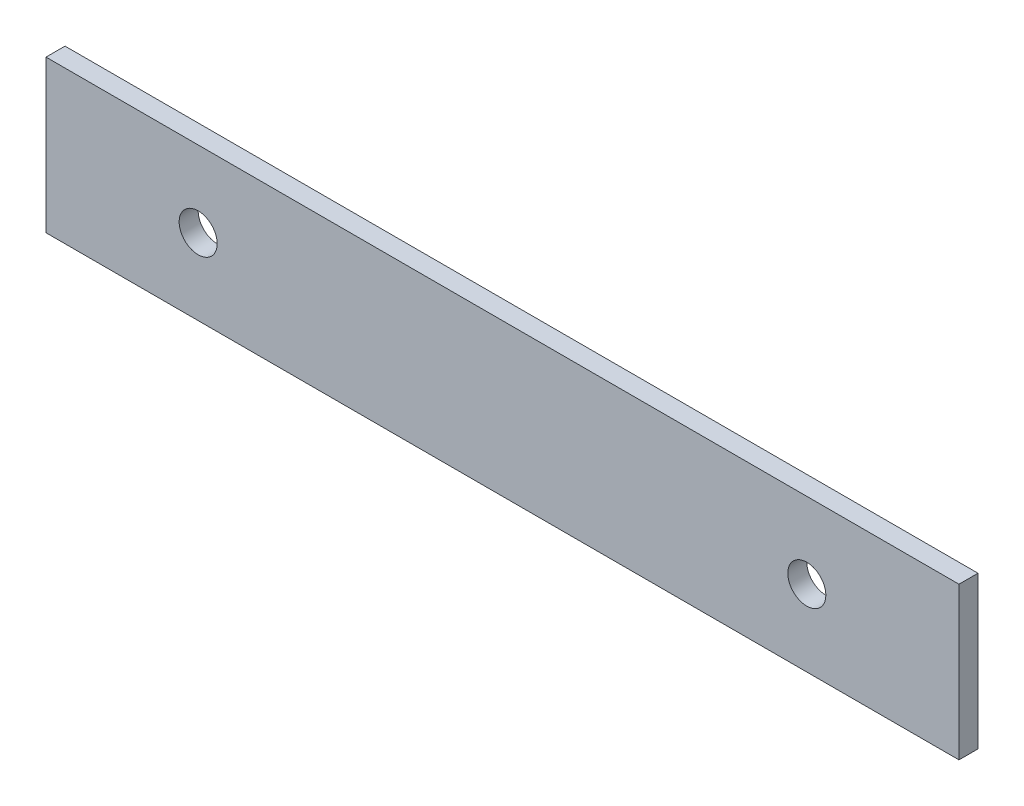
ISO-10303-21;
HEADER;
FILE_DESCRIPTION(('STEP AP214'),'2;1');
FILE_NAME('part.step','',(''),(''),'','','');
FILE_SCHEMA(('AUTOMOTIVE_DESIGN { 1 0 10303 214 1 1 1 1 }'));
ENDSEC;
DATA;
#1=APPLICATION_CONTEXT('core data for automotive mechanical design processes');
#2=APPLICATION_PROTOCOL_DEFINITION('international standard','automotive_design',2000,#1);
#3=PRODUCT_CONTEXT('',#1,'mechanical');
#4=PRODUCT('Part','Part','',(#3));
#5=PRODUCT_RELATED_PRODUCT_CATEGORY('part','',(#4));
#6=PRODUCT_DEFINITION_FORMATION('','',#4);
#7=PRODUCT_DEFINITION_CONTEXT('part definition',#1,'design');
#8=PRODUCT_DEFINITION('design','',#6,#7);
#9=PRODUCT_DEFINITION_SHAPE('','',#8);
#10=(LENGTH_UNIT() NAMED_UNIT(*) SI_UNIT(.MILLI.,.METRE.));
#11=(NAMED_UNIT(*) PLANE_ANGLE_UNIT() SI_UNIT($,.RADIAN.));
#12=(NAMED_UNIT(*) SI_UNIT($,.STERADIAN.) SOLID_ANGLE_UNIT());
#13=UNCERTAINTY_MEASURE_WITH_UNIT(LENGTH_MEASURE(1.E-05),#10,'distance_accuracy_value','');
#14=(GEOMETRIC_REPRESENTATION_CONTEXT(3) GLOBAL_UNCERTAINTY_ASSIGNED_CONTEXT((#13)) GLOBAL_UNIT_ASSIGNED_CONTEXT((#10,
#11,#12)) REPRESENTATION_CONTEXT('',''));
#15=CARTESIAN_POINT('',(0.,0.,0.));
#16=DIRECTION('',(0.,0.,1.));
#17=DIRECTION('',(1.,0.,0.));
#18=AXIS2_PLACEMENT_3D('',#15,#16,#17);
#19=CARTESIAN_POINT('',(0.,0.,3.175));
#20=DIRECTION('',(0.,0.,1.));
#21=DIRECTION('',(1.,0.,0.));
#22=AXIS2_PLACEMENT_3D('',#19,#20,#21);
#23=PLANE('',#22);
#24=CARTESIAN_POINT('',(50.8,0.,3.175));
#25=DIRECTION('',(0.,0.,1.));
#26=DIRECTION('',(1.,0.,0.));
#27=AXIS2_PLACEMENT_3D('',#24,#25,#26);
#28=CIRCLE('',#27,3.175);
#29=CARTESIAN_POINT('',(53.975,0.,3.175));
#30=VERTEX_POINT('',#29);
#31=EDGE_CURVE('E99',#30,#30,#28,.T.);
#32=ORIENTED_EDGE('',*,*,#31,.F.);
#33=EDGE_LOOP('',(#32));
#34=FACE_BOUND('',#33,.T.);
#35=DIRECTION('',(0.,-1.,0.));
#36=VECTOR('',#35,1.);
#37=CARTESIAN_POINT('',(-76.2,-12.7,3.175));
#38=LINE('',#37,#36);
#39=CARTESIAN_POINT('',(-76.2,12.7,3.175));
#40=VERTEX_POINT('',#39);
#41=CARTESIAN_POINT('',(-76.2,-12.7,3.175));
#42=VERTEX_POINT('',#41);
#43=EDGE_CURVE('E84',#40,#42,#38,.T.);
#44=ORIENTED_EDGE('',*,*,#43,.T.);
#45=DIRECTION('',(1.,0.,0.));
#46=VECTOR('',#45,1.);
#47=CARTESIAN_POINT('',(76.2,-12.7,3.175));
#48=LINE('',#47,#46);
#49=CARTESIAN_POINT('',(76.2,-12.7,3.175));
#50=VERTEX_POINT('',#49);
#51=EDGE_CURVE('E79',#42,#50,#48,.T.);
#52=ORIENTED_EDGE('',*,*,#51,.T.);
#53=DIRECTION('',(0.,1.,0.));
#54=VECTOR('',#53,1.);
#55=CARTESIAN_POINT('',(76.2,-12.7,3.175));
#56=LINE('',#55,#54);
#57=CARTESIAN_POINT('',(76.2,12.7,3.175));
#58=VERTEX_POINT('',#57);
#59=EDGE_CURVE('E82',#50,#58,#56,.T.);
#60=ORIENTED_EDGE('',*,*,#59,.T.);
#61=DIRECTION('',(-1.,0.,0.));
#62=VECTOR('',#61,1.);
#63=CARTESIAN_POINT('',(76.2,12.7,3.175));
#64=LINE('',#63,#62);
#65=EDGE_CURVE('E49',#58,#40,#64,.T.);
#66=ORIENTED_EDGE('',*,*,#65,.T.);
#67=EDGE_LOOP('',(#44,#52,#60,#66));
#68=FACE_BOUND('',#67,.T.);
#69=CARTESIAN_POINT('',(-50.7999999999999,0.,3.175));
#70=DIRECTION('',(0.,0.,1.));
#71=DIRECTION('',(-1.,0.,0.));
#72=AXIS2_PLACEMENT_3D('',#69,#70,#71);
#73=CIRCLE('',#72,3.175);
#74=CARTESIAN_POINT('',(-53.9749999999999,0.,3.175));
#75=VERTEX_POINT('',#74);
#76=EDGE_CURVE('E114',#75,#75,#73,.T.);
#77=ORIENTED_EDGE('',*,*,#76,.F.);
#78=EDGE_LOOP('',(#77));
#79=FACE_BOUND('',#78,.T.);
#80=ADVANCED_FACE('F32',(#34,#68,#79),#23,.T.);
#81=CARTESIAN_POINT('',(0.,0.,0.));
#82=DIRECTION('',(0.,0.,1.));
#83=DIRECTION('',(1.,0.,0.));
#84=AXIS2_PLACEMENT_3D('',#81,#82,#83);
#85=PLANE('',#84);
#86=CARTESIAN_POINT('',(50.8,0.,0.));
#87=DIRECTION('',(0.,0.,1.));
#88=DIRECTION('',(1.,0.,0.));
#89=AXIS2_PLACEMENT_3D('',#86,#87,#88);
#90=CIRCLE('',#89,3.175);
#91=CARTESIAN_POINT('',(53.975,0.,0.));
#92=VERTEX_POINT('',#91);
#93=EDGE_CURVE('E111',#92,#92,#90,.T.);
#94=ORIENTED_EDGE('',*,*,#93,.T.);
#95=EDGE_LOOP('',(#94));
#96=FACE_BOUND('',#95,.T.);
#97=DIRECTION('',(0.,-1.,0.));
#98=VECTOR('',#97,1.);
#99=CARTESIAN_POINT('',(-76.2,-12.7,0.));
#100=LINE('',#99,#98);
#101=CARTESIAN_POINT('',(-76.2,12.7,0.));
#102=VERTEX_POINT('',#101);
#103=CARTESIAN_POINT('',(-76.2,-12.7,0.));
#104=VERTEX_POINT('',#103);
#105=EDGE_CURVE('E96',#102,#104,#100,.T.);
#106=ORIENTED_EDGE('',*,*,#105,.F.);
#107=DIRECTION('',(-1.,0.,0.));
#108=VECTOR('',#107,1.);
#109=CARTESIAN_POINT('',(76.2,12.7,0.));
#110=LINE('',#109,#108);
#111=CARTESIAN_POINT('',(76.2,12.7,0.));
#112=VERTEX_POINT('',#111);
#113=EDGE_CURVE('E72',#112,#102,#110,.T.);
#114=ORIENTED_EDGE('',*,*,#113,.F.);
#115=DIRECTION('',(0.,1.,0.));
#116=VECTOR('',#115,1.);
#117=CARTESIAN_POINT('',(76.2,-12.7,0.));
#118=LINE('',#117,#116);
#119=CARTESIAN_POINT('',(76.2,-12.7,0.));
#120=VERTEX_POINT('',#119);
#121=EDGE_CURVE('E66',#120,#112,#118,.T.);
#122=ORIENTED_EDGE('',*,*,#121,.F.);
#123=DIRECTION('',(1.,0.,0.));
#124=VECTOR('',#123,1.);
#125=CARTESIAN_POINT('',(76.2,-12.7,0.));
#126=LINE('',#125,#124);
#127=EDGE_CURVE('E88',#104,#120,#126,.T.);
#128=ORIENTED_EDGE('',*,*,#127,.F.);
#129=EDGE_LOOP('',(#106,#114,#122,#128));
#130=FACE_BOUND('',#129,.T.);
#131=CARTESIAN_POINT('',(-50.7999999999999,0.,0.));
#132=DIRECTION('',(0.,0.,1.));
#133=DIRECTION('',(-1.,0.,0.));
#134=AXIS2_PLACEMENT_3D('',#131,#132,#133);
#135=CIRCLE('',#134,3.175);
#136=CARTESIAN_POINT('',(-53.9749999999999,0.,0.));
#137=VERTEX_POINT('',#136);
#138=EDGE_CURVE('E117',#137,#137,#135,.T.);
#139=ORIENTED_EDGE('',*,*,#138,.T.);
#140=EDGE_LOOP('',(#139));
#141=FACE_BOUND('',#140,.T.);
#142=ADVANCED_FACE('F107',(#96,#130,#141),#85,.F.);
#143=CARTESIAN_POINT('',(-76.2,-12.7,3.175));
#144=DIRECTION('',(1.,0.,0.));
#145=DIRECTION('',(0.,0.,-1.));
#146=AXIS2_PLACEMENT_3D('',#143,#144,#145);
#147=PLANE('',#146);
#148=ORIENTED_EDGE('',*,*,#105,.T.);
#149=DIRECTION('',(0.,0.,-1.));
#150=VECTOR('',#149,1.);
#151=CARTESIAN_POINT('',(-76.2,-12.7,3.175));
#152=LINE('',#151,#150);
#153=EDGE_CURVE('E11',#42,#104,#152,.T.);
#154=ORIENTED_EDGE('',*,*,#153,.F.);
#155=ORIENTED_EDGE('',*,*,#43,.F.);
#156=DIRECTION('',(0.,0.,-1.));
#157=VECTOR('',#156,1.);
#158=CARTESIAN_POINT('',(-76.2,12.7,3.175));
#159=LINE('',#158,#157);
#160=EDGE_CURVE('E92',#40,#102,#159,.T.);
#161=ORIENTED_EDGE('',*,*,#160,.T.);
#162=EDGE_LOOP('',(#148,#154,#155,#161));
#163=FACE_BOUND('',#162,.T.);
#164=ADVANCED_FACE('F34',(#163),#147,.F.);
#165=CARTESIAN_POINT('',(76.2,-12.7,3.175));
#166=DIRECTION('',(0.,1.,0.));
#167=DIRECTION('',(-1.,0.,0.));
#168=AXIS2_PLACEMENT_3D('',#165,#166,#167);
#169=PLANE('',#168);
#170=ORIENTED_EDGE('',*,*,#127,.T.);
#171=DIRECTION('',(0.,0.,-1.));
#172=VECTOR('',#171,1.);
#173=CARTESIAN_POINT('',(76.2,-12.7,3.175));
#174=LINE('',#173,#172);
#175=EDGE_CURVE('E41',#50,#120,#174,.T.);
#176=ORIENTED_EDGE('',*,*,#175,.F.);
#177=ORIENTED_EDGE('',*,*,#51,.F.);
#178=ORIENTED_EDGE('',*,*,#153,.T.);
#179=EDGE_LOOP('',(#170,#176,#177,#178));
#180=FACE_BOUND('',#179,.T.);
#181=ADVANCED_FACE('F87',(#180),#169,.F.);
#182=CARTESIAN_POINT('',(76.2,-12.7,3.175));
#183=DIRECTION('',(-1.,0.,0.));
#184=DIRECTION('',(0.,0.,1.));
#185=AXIS2_PLACEMENT_3D('',#182,#183,#184);
#186=PLANE('',#185);
#187=ORIENTED_EDGE('',*,*,#121,.T.);
#188=DIRECTION('',(0.,0.,-1.));
#189=VECTOR('',#188,1.);
#190=CARTESIAN_POINT('',(76.2,12.7,3.175));
#191=LINE('',#190,#189);
#192=EDGE_CURVE('E89',#58,#112,#191,.T.);
#193=ORIENTED_EDGE('',*,*,#192,.F.);
#194=ORIENTED_EDGE('',*,*,#59,.F.);
#195=ORIENTED_EDGE('',*,*,#175,.T.);
#196=EDGE_LOOP('',(#187,#193,#194,#195));
#197=FACE_BOUND('',#196,.T.);
#198=ADVANCED_FACE('F90',(#197),#186,.F.);
#199=CARTESIAN_POINT('',(76.2,12.7,3.175));
#200=DIRECTION('',(0.,-1.,0.));
#201=DIRECTION('',(1.,0.,0.));
#202=AXIS2_PLACEMENT_3D('',#199,#200,#201);
#203=PLANE('',#202);
#204=ORIENTED_EDGE('',*,*,#113,.T.);
#205=ORIENTED_EDGE('',*,*,#160,.F.);
#206=ORIENTED_EDGE('',*,*,#65,.F.);
#207=ORIENTED_EDGE('',*,*,#192,.T.);
#208=EDGE_LOOP('',(#204,#205,#206,#207));
#209=FACE_BOUND('',#208,.T.);
#210=ADVANCED_FACE('F104',(#209),#203,.F.);
#211=CARTESIAN_POINT('',(50.8,0.,3.175));
#212=DIRECTION('',(0.,0.,-1.));
#213=DIRECTION('',(-1.,0.,0.));
#214=AXIS2_PLACEMENT_3D('',#211,#212,#213);
#215=CYLINDRICAL_SURFACE('',#214,3.175);
#216=ORIENTED_EDGE('',*,*,#31,.T.);
#217=EDGE_LOOP('',(#216));
#218=FACE_BOUND('',#217,.T.);
#219=ORIENTED_EDGE('',*,*,#93,.F.);
#220=EDGE_LOOP('',(#219));
#221=FACE_BOUND('',#220,.T.);
#222=ADVANCED_FACE('F135',(#218,#221),#215,.F.);
#223=CARTESIAN_POINT('',(-50.7999999999999,0.,3.175));
#224=DIRECTION('',(0.,0.,-1.));
#225=DIRECTION('',(-1.,0.,0.));
#226=AXIS2_PLACEMENT_3D('',#223,#224,#225);
#227=CYLINDRICAL_SURFACE('',#226,3.175);
#228=ORIENTED_EDGE('',*,*,#76,.T.);
#229=EDGE_LOOP('',(#228));
#230=FACE_BOUND('',#229,.T.);
#231=ORIENTED_EDGE('',*,*,#138,.F.);
#232=EDGE_LOOP('',(#231));
#233=FACE_BOUND('',#232,.T.);
#234=ADVANCED_FACE('F123',(#230,#233),#227,.F.);
#235=CLOSED_SHELL('',(#80,#142,#164,#181,#198,#210,#222,#234));
#236=MANIFOLD_SOLID_BREP('B2',#235);
#237=ADVANCED_BREP_SHAPE_REPRESENTATION('',(#18,#236),#14);
#238=SHAPE_DEFINITION_REPRESENTATION(#9,#237);
ENDSEC;
END-ISO-10303-21;
